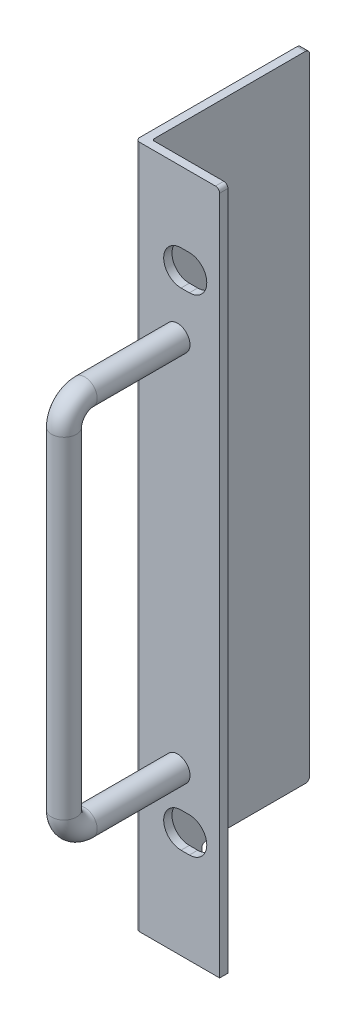
ISO-10303-21;
HEADER;
FILE_DESCRIPTION(('STEP AP214'),'2;1');
FILE_NAME('part.step','',(''),(''),'','','');
FILE_SCHEMA(('AUTOMOTIVE_DESIGN { 1 0 10303 214 1 1 1 1 }'));
ENDSEC;
DATA;
#1=APPLICATION_CONTEXT('core data for automotive mechanical design processes');
#2=APPLICATION_PROTOCOL_DEFINITION('international standard','automotive_design',2000,#1);
#3=PRODUCT_CONTEXT('',#1,'mechanical');
#4=PRODUCT('Part','Part','',(#3));
#5=PRODUCT_RELATED_PRODUCT_CATEGORY('part','',(#4));
#6=PRODUCT_DEFINITION_FORMATION('','',#4);
#7=PRODUCT_DEFINITION_CONTEXT('part definition',#1,'design');
#8=PRODUCT_DEFINITION('design','',#6,#7);
#9=PRODUCT_DEFINITION_SHAPE('','',#8);
#10=(LENGTH_UNIT() NAMED_UNIT(*) SI_UNIT(.MILLI.,.METRE.));
#11=(NAMED_UNIT(*) PLANE_ANGLE_UNIT() SI_UNIT($,.RADIAN.));
#12=(NAMED_UNIT(*) SI_UNIT($,.STERADIAN.) SOLID_ANGLE_UNIT());
#13=UNCERTAINTY_MEASURE_WITH_UNIT(LENGTH_MEASURE(1.E-05),#10,'distance_accuracy_value','');
#14=(GEOMETRIC_REPRESENTATION_CONTEXT(3) GLOBAL_UNCERTAINTY_ASSIGNED_CONTEXT((#13)) GLOBAL_UNIT_ASSIGNED_CONTEXT((#10,
#11,#12)) REPRESENTATION_CONTEXT('',''));
#15=CARTESIAN_POINT('',(0.,0.,0.));
#16=DIRECTION('',(0.,0.,1.));
#17=DIRECTION('',(1.,0.,0.));
#18=AXIS2_PLACEMENT_3D('',#15,#16,#17);
#19=CARTESIAN_POINT('',(0.,165.,0.));
#20=DIRECTION('',(0.,0.,-1.));
#21=DIRECTION('',(-1.,0.,0.));
#22=AXIS2_PLACEMENT_3D('',#19,#20,#21);
#23=PLANE('',#22);
#24=CARTESIAN_POINT('',(10.15,128.745,0.));
#25=DIRECTION('',(0.,0.,1.));
#26=DIRECTION('',(1.,0.,0.));
#27=AXIS2_PLACEMENT_3D('',#24,#25,#26);
#28=CIRCLE('',#27,3.);
#29=CARTESIAN_POINT('',(13.15,128.745,0.));
#30=VERTEX_POINT('',#29);
#31=EDGE_CURVE('E299',#30,#30,#28,.T.);
#32=ORIENTED_EDGE('',*,*,#31,.F.);
#33=EDGE_LOOP('',(#32));
#34=FACE_BOUND('',#33,.T.);
#35=DIRECTION('',(-1.,0.,0.));
#36=VECTOR('',#35,1.);
#37=CARTESIAN_POINT('',(13.,147.945,0.));
#38=LINE('',#37,#36);
#39=CARTESIAN_POINT('',(13.,147.945,0.));
#40=VERTEX_POINT('',#39);
#41=CARTESIAN_POINT('',(11.,147.945,0.));
#42=VERTEX_POINT('',#41);
#43=EDGE_CURVE('E206',#40,#42,#38,.T.);
#44=ORIENTED_EDGE('',*,*,#43,.F.);
#45=CARTESIAN_POINT('',(13.,143.745,0.));
#46=DIRECTION('',(0.,0.,1.));
#47=DIRECTION('',(1.,0.,0.));
#48=AXIS2_PLACEMENT_3D('',#45,#46,#47);
#49=CIRCLE('',#48,4.19999999999998);
#50=CARTESIAN_POINT('',(13.,139.545,0.));
#51=VERTEX_POINT('',#50);
#52=EDGE_CURVE('E211',#51,#40,#49,.T.);
#53=ORIENTED_EDGE('',*,*,#52,.F.);
#54=DIRECTION('',(1.,0.,0.));
#55=VECTOR('',#54,1.);
#56=CARTESIAN_POINT('',(13.,139.545,0.));
#57=LINE('',#56,#55);
#58=CARTESIAN_POINT('',(11.,139.545,0.));
#59=VERTEX_POINT('',#58);
#60=EDGE_CURVE('E215',#59,#51,#57,.T.);
#61=ORIENTED_EDGE('',*,*,#60,.F.);
#62=CARTESIAN_POINT('',(11.,143.745,0.));
#63=DIRECTION('',(0.,0.,1.));
#64=DIRECTION('',(1.,0.,0.));
#65=AXIS2_PLACEMENT_3D('',#62,#63,#64);
#66=CIRCLE('',#65,4.19999999999998);
#67=EDGE_CURVE('E195',#42,#59,#66,.T.);
#68=ORIENTED_EDGE('',*,*,#67,.F.);
#69=EDGE_LOOP('',(#44,#53,#61,#68));
#70=FACE_BOUND('',#69,.T.);
#71=DIRECTION('',(-1.,0.,0.));
#72=VECTOR('',#71,1.);
#73=CARTESIAN_POINT('',(13.,30.455,0.));
#74=LINE('',#73,#72);
#75=CARTESIAN_POINT('',(13.,30.455,0.));
#76=VERTEX_POINT('',#75);
#77=CARTESIAN_POINT('',(11.,30.455,0.));
#78=VERTEX_POINT('',#77);
#79=EDGE_CURVE('E227',#76,#78,#74,.T.);
#80=ORIENTED_EDGE('',*,*,#79,.F.);
#81=CARTESIAN_POINT('',(13.,26.255,0.));
#82=DIRECTION('',(0.,0.,1.));
#83=DIRECTION('',(-1.,0.,0.));
#84=AXIS2_PLACEMENT_3D('',#81,#82,#83);
#85=CIRCLE('',#84,4.19999999999997);
#86=CARTESIAN_POINT('',(13.,22.055,0.));
#87=VERTEX_POINT('',#86);
#88=EDGE_CURVE('E225',#87,#76,#85,.T.);
#89=ORIENTED_EDGE('',*,*,#88,.F.);
#90=DIRECTION('',(1.,0.,0.));
#91=VECTOR('',#90,1.);
#92=CARTESIAN_POINT('',(13.,22.055,0.));
#93=LINE('',#92,#91);
#94=CARTESIAN_POINT('',(11.,22.055,0.));
#95=VERTEX_POINT('',#94);
#96=EDGE_CURVE('E234',#95,#87,#93,.T.);
#97=ORIENTED_EDGE('',*,*,#96,.F.);
#98=CARTESIAN_POINT('',(11.,26.255,0.));
#99=DIRECTION('',(0.,0.,1.));
#100=DIRECTION('',(-1.,0.,0.));
#101=AXIS2_PLACEMENT_3D('',#98,#99,#100);
#102=CIRCLE('',#101,4.19999999999997);
#103=EDGE_CURVE('E231',#78,#95,#102,.T.);
#104=ORIENTED_EDGE('',*,*,#103,.F.);
#105=EDGE_LOOP('',(#80,#89,#97,#104));
#106=FACE_BOUND('',#105,.T.);
#107=DIRECTION('',(1.,0.,0.));
#108=VECTOR('',#107,1.);
#109=CARTESIAN_POINT('',(0.,165.,0.));
#110=LINE('',#109,#108);
#111=CARTESIAN_POINT('',(1.,165.,0.));
#112=VERTEX_POINT('',#111);
#113=CARTESIAN_POINT('',(19.3,165.,0.));
#114=VERTEX_POINT('',#113);
#115=EDGE_CURVE('E246',#112,#114,#110,.T.);
#116=ORIENTED_EDGE('',*,*,#115,.F.);
#117=DIRECTION('',(0.,-1.,0.));
#118=VECTOR('',#117,1.);
#119=CARTESIAN_POINT('',(1.,165.,0.));
#120=LINE('',#119,#118);
#121=CARTESIAN_POINT('',(1.,0.,0.));
#122=VERTEX_POINT('',#121);
#123=EDGE_CURVE('E305',#112,#122,#120,.T.);
#124=ORIENTED_EDGE('',*,*,#123,.T.);
#125=DIRECTION('',(1.,0.,0.));
#126=VECTOR('',#125,1.);
#127=CARTESIAN_POINT('',(0.,0.,0.));
#128=LINE('',#127,#126);
#129=CARTESIAN_POINT('',(20.3,0.,0.));
#130=VERTEX_POINT('',#129);
#131=EDGE_CURVE('E222',#122,#130,#128,.T.);
#132=ORIENTED_EDGE('',*,*,#131,.T.);
#133=DIRECTION('',(0.,-1.,0.));
#134=VECTOR('',#133,1.);
#135=CARTESIAN_POINT('',(20.3,165.,0.));
#136=LINE('',#135,#134);
#137=CARTESIAN_POINT('',(20.3,164.,0.));
#138=VERTEX_POINT('',#137);
#139=EDGE_CURVE('E276',#138,#130,#136,.T.);
#140=ORIENTED_EDGE('',*,*,#139,.F.);
#141=CARTESIAN_POINT('',(19.3,164.,0.));
#142=DIRECTION('',(0.,0.,-1.));
#143=DIRECTION('',(-1.,0.,0.));
#144=AXIS2_PLACEMENT_3D('',#141,#142,#143);
#145=CIRCLE('',#144,1.);
#146=EDGE_CURVE('E303',#138,#114,#145,.F.);
#147=ORIENTED_EDGE('',*,*,#146,.T.);
#148=EDGE_LOOP('',(#116,#124,#132,#140,#147));
#149=FACE_BOUND('',#148,.T.);
#150=CARTESIAN_POINT('',(10.15,38.745,0.));
#151=DIRECTION('',(0.,0.,-1.));
#152=DIRECTION('',(1.,0.,0.));
#153=AXIS2_PLACEMENT_3D('',#150,#151,#152);
#154=CIRCLE('',#153,3.);
#155=CARTESIAN_POINT('',(13.15,38.745,0.));
#156=VERTEX_POINT('',#155);
#157=EDGE_CURVE('E387',#156,#156,#154,.T.);
#158=ORIENTED_EDGE('',*,*,#157,.T.);
#159=EDGE_LOOP('',(#158));
#160=FACE_BOUND('',#159,.T.);
#161=ADVANCED_FACE('F35',(#34,#70,#106,#149,#160),#23,.F.);
#162=CARTESIAN_POINT('',(20.3,165.,0.));
#163=DIRECTION('',(-1.,0.,0.));
#164=DIRECTION('',(0.,0.,1.));
#165=AXIS2_PLACEMENT_3D('',#162,#163,#164);
#166=PLANE('',#165);
#167=DIRECTION('',(0.,-1.,0.));
#168=VECTOR('',#167,1.);
#169=CARTESIAN_POINT('',(20.3,165.,-2.));
#170=LINE('',#169,#168);
#171=CARTESIAN_POINT('',(20.3,164.,-2.));
#172=VERTEX_POINT('',#171);
#173=CARTESIAN_POINT('',(20.3,0.,-2.));
#174=VERTEX_POINT('',#173);
#175=EDGE_CURVE('E274',#172,#174,#170,.T.);
#176=ORIENTED_EDGE('',*,*,#175,.F.);
#177=DIRECTION('',(0.,0.,-1.));
#178=VECTOR('',#177,1.);
#179=CARTESIAN_POINT('',(20.3,164.,0.));
#180=LINE('',#179,#178);
#181=EDGE_CURVE('E331',#172,#138,#180,.F.);
#182=ORIENTED_EDGE('',*,*,#181,.T.);
#183=ORIENTED_EDGE('',*,*,#139,.T.);
#184=DIRECTION('',(0.,0.,-1.));
#185=VECTOR('',#184,1.);
#186=CARTESIAN_POINT('',(20.3,0.,0.));
#187=LINE('',#186,#185);
#188=EDGE_CURVE('E260',#130,#174,#187,.T.);
#189=ORIENTED_EDGE('',*,*,#188,.T.);
#190=EDGE_LOOP('',(#176,#182,#183,#189));
#191=FACE_BOUND('',#190,.T.);
#192=ADVANCED_FACE('F415',(#191),#166,.F.);
#193=CARTESIAN_POINT('',(2.,165.,-2.));
#194=DIRECTION('',(0.,0.,1.));
#195=DIRECTION('',(1.,0.,0.));
#196=AXIS2_PLACEMENT_3D('',#193,#194,#195);
#197=PLANE('',#196);
#198=DIRECTION('',(1.,0.,0.));
#199=VECTOR('',#198,1.);
#200=CARTESIAN_POINT('',(2.,139.545,-2.));
#201=LINE('',#200,#199);
#202=CARTESIAN_POINT('',(11.,139.545,-2.));
#203=VERTEX_POINT('',#202);
#204=CARTESIAN_POINT('',(13.,139.545,-2.));
#205=VERTEX_POINT('',#204);
#206=EDGE_CURVE('E293',#203,#205,#201,.T.);
#207=ORIENTED_EDGE('',*,*,#206,.T.);
#208=CARTESIAN_POINT('',(13.,143.745,-2.));
#209=DIRECTION('',(0.,0.,1.));
#210=DIRECTION('',(1.,0.,0.));
#211=AXIS2_PLACEMENT_3D('',#208,#209,#210);
#212=CIRCLE('',#211,4.19999999999998);
#213=CARTESIAN_POINT('',(13.,147.945,-2.));
#214=VERTEX_POINT('',#213);
#215=EDGE_CURVE('E296',#205,#214,#212,.T.);
#216=ORIENTED_EDGE('',*,*,#215,.T.);
#217=DIRECTION('',(-1.,0.,0.));
#218=VECTOR('',#217,1.);
#219=CARTESIAN_POINT('',(2.,147.945,-2.));
#220=LINE('',#219,#218);
#221=CARTESIAN_POINT('',(11.,147.945,-2.));
#222=VERTEX_POINT('',#221);
#223=EDGE_CURVE('E290',#214,#222,#220,.T.);
#224=ORIENTED_EDGE('',*,*,#223,.T.);
#225=CARTESIAN_POINT('',(11.,143.745,-2.));
#226=DIRECTION('',(0.,0.,1.));
#227=DIRECTION('',(1.,0.,0.));
#228=AXIS2_PLACEMENT_3D('',#225,#226,#227);
#229=CIRCLE('',#228,4.19999999999998);
#230=EDGE_CURVE('E198',#222,#203,#229,.T.);
#231=ORIENTED_EDGE('',*,*,#230,.T.);
#232=EDGE_LOOP('',(#207,#216,#224,#231));
#233=FACE_BOUND('',#232,.T.);
#234=DIRECTION('',(1.,0.,0.));
#235=VECTOR('',#234,1.);
#236=CARTESIAN_POINT('',(2.,22.055,-2.));
#237=LINE('',#236,#235);
#238=CARTESIAN_POINT('',(11.,22.055,-2.));
#239=VERTEX_POINT('',#238);
#240=CARTESIAN_POINT('',(13.,22.055,-2.));
#241=VERTEX_POINT('',#240);
#242=EDGE_CURVE('E284',#239,#241,#237,.T.);
#243=ORIENTED_EDGE('',*,*,#242,.T.);
#244=CARTESIAN_POINT('',(13.,26.255,-2.));
#245=DIRECTION('',(0.,0.,1.));
#246=DIRECTION('',(1.,0.,0.));
#247=AXIS2_PLACEMENT_3D('',#244,#245,#246);
#248=CIRCLE('',#247,4.19999999999997);
#249=CARTESIAN_POINT('',(13.,30.455,-2.));
#250=VERTEX_POINT('',#249);
#251=EDGE_CURVE('E287',#241,#250,#248,.T.);
#252=ORIENTED_EDGE('',*,*,#251,.T.);
#253=DIRECTION('',(-1.,0.,0.));
#254=VECTOR('',#253,1.);
#255=CARTESIAN_POINT('',(2.,30.455,-2.));
#256=LINE('',#255,#254);
#257=CARTESIAN_POINT('',(11.,30.455,-2.));
#258=VERTEX_POINT('',#257);
#259=EDGE_CURVE('E278',#250,#258,#256,.T.);
#260=ORIENTED_EDGE('',*,*,#259,.T.);
#261=CARTESIAN_POINT('',(11.,26.255,-2.));
#262=DIRECTION('',(0.,0.,1.));
#263=DIRECTION('',(1.,0.,0.));
#264=AXIS2_PLACEMENT_3D('',#261,#262,#263);
#265=CIRCLE('',#264,4.19999999999997);
#266=EDGE_CURVE('E281',#258,#239,#265,.T.);
#267=ORIENTED_EDGE('',*,*,#266,.T.);
#268=EDGE_LOOP('',(#243,#252,#260,#267));
#269=FACE_BOUND('',#268,.T.);
#270=DIRECTION('',(-1.,0.,0.));
#271=VECTOR('',#270,1.);
#272=CARTESIAN_POINT('',(2.,0.,-2.));
#273=LINE('',#272,#271);
#274=CARTESIAN_POINT('',(2.5,0.,-2.));
#275=VERTEX_POINT('',#274);
#276=EDGE_CURVE('E263',#174,#275,#273,.T.);
#277=ORIENTED_EDGE('',*,*,#276,.T.);
#278=DIRECTION('',(0.,-1.,0.));
#279=VECTOR('',#278,1.);
#280=CARTESIAN_POINT('',(2.5,165.,-2.));
#281=LINE('',#280,#279);
#282=CARTESIAN_POINT('',(2.5,165.,-2.));
#283=VERTEX_POINT('',#282);
#284=EDGE_CURVE('E56',#275,#283,#281,.F.);
#285=ORIENTED_EDGE('',*,*,#284,.T.);
#286=DIRECTION('',(-1.,0.,0.));
#287=VECTOR('',#286,1.);
#288=CARTESIAN_POINT('',(2.,165.,-2.));
#289=LINE('',#288,#287);
#290=CARTESIAN_POINT('',(19.3,165.,-2.));
#291=VERTEX_POINT('',#290);
#292=EDGE_CURVE('E249',#291,#283,#289,.T.);
#293=ORIENTED_EDGE('',*,*,#292,.F.);
#294=CARTESIAN_POINT('',(19.3,164.,-2.));
#295=DIRECTION('',(0.,0.,1.));
#296=DIRECTION('',(1.,0.,0.));
#297=AXIS2_PLACEMENT_3D('',#294,#295,#296);
#298=CIRCLE('',#297,1.);
#299=EDGE_CURVE('E329',#291,#172,#298,.F.);
#300=ORIENTED_EDGE('',*,*,#299,.T.);
#301=ORIENTED_EDGE('',*,*,#175,.T.);
#302=EDGE_LOOP('',(#277,#285,#293,#300,#301));
#303=FACE_BOUND('',#302,.T.);
#304=ADVANCED_FACE('F412',(#233,#269,#303),#197,.F.);
#305=CARTESIAN_POINT('',(2.,165.,-2.));
#306=DIRECTION('',(-1.,0.,0.));
#307=DIRECTION('',(0.,0.,1.));
#308=AXIS2_PLACEMENT_3D('',#305,#306,#307);
#309=PLANE('',#308);
#310=DIRECTION('',(0.,0.,-1.));
#311=VECTOR('',#310,1.);
#312=CARTESIAN_POINT('',(2.,165.,-2.));
#313=LINE('',#312,#311);
#314=CARTESIAN_POINT('',(2.,165.,-2.5));
#315=VERTEX_POINT('',#314);
#316=CARTESIAN_POINT('',(2.,165.,-39.));
#317=VERTEX_POINT('',#316);
#318=EDGE_CURVE('E252',#315,#317,#313,.T.);
#319=ORIENTED_EDGE('',*,*,#318,.F.);
#320=DIRECTION('',(0.,-1.,0.));
#321=VECTOR('',#320,1.);
#322=CARTESIAN_POINT('',(2.,0.,-2.5));
#323=LINE('',#322,#321);
#324=CARTESIAN_POINT('',(2.,0.,-2.5));
#325=VERTEX_POINT('',#324);
#326=EDGE_CURVE('E358',#315,#325,#323,.T.);
#327=ORIENTED_EDGE('',*,*,#326,.T.);
#328=DIRECTION('',(0.,0.,-1.));
#329=VECTOR('',#328,1.);
#330=CARTESIAN_POINT('',(2.,0.,-2.));
#331=LINE('',#330,#329);
#332=CARTESIAN_POINT('',(2.,0.,-13.));
#333=VERTEX_POINT('',#332);
#334=EDGE_CURVE('E265',#325,#333,#331,.T.);
#335=ORIENTED_EDGE('',*,*,#334,.T.);
#336=CARTESIAN_POINT('',(2.,1.,-13.));
#337=DIRECTION('',(-1.,0.,0.));
#338=DIRECTION('',(0.,0.,1.));
#339=AXIS2_PLACEMENT_3D('',#336,#337,#338);
#340=CIRCLE('',#339,1.);
#341=CARTESIAN_POINT('',(2.,1.,-14.));
#342=VERTEX_POINT('',#341);
#343=EDGE_CURVE('E337',#333,#342,#340,.F.);
#344=ORIENTED_EDGE('',*,*,#343,.T.);
#345=DIRECTION('',(0.,-1.,0.));
#346=VECTOR('',#345,1.);
#347=CARTESIAN_POINT('',(2.,0.,-14.));
#348=LINE('',#347,#346);
#349=CARTESIAN_POINT('',(2.,11.,-14.));
#350=VERTEX_POINT('',#349);
#351=EDGE_CURVE('E378',#350,#342,#348,.T.);
#352=ORIENTED_EDGE('',*,*,#351,.F.);
#353=CARTESIAN_POINT('',(2.,11.,-15.));
#354=DIRECTION('',(-1.,0.,0.));
#355=DIRECTION('',(0.,0.,1.));
#356=AXIS2_PLACEMENT_3D('',#353,#354,#355);
#357=CIRCLE('',#356,1.);
#358=CARTESIAN_POINT('',(2.,12.,-15.));
#359=VERTEX_POINT('',#358);
#360=EDGE_CURVE('E354',#350,#359,#357,.T.);
#361=ORIENTED_EDGE('',*,*,#360,.T.);
#362=DIRECTION('',(0.,0.,1.));
#363=VECTOR('',#362,1.);
#364=CARTESIAN_POINT('',(2.,12.,-40.));
#365=LINE('',#364,#363);
#366=CARTESIAN_POINT('',(2.,12.,-39.));
#367=VERTEX_POINT('',#366);
#368=EDGE_CURVE('E385',#367,#359,#365,.T.);
#369=ORIENTED_EDGE('',*,*,#368,.F.);
#370=CARTESIAN_POINT('',(2.,13.,-39.));
#371=DIRECTION('',(-1.,0.,0.));
#372=DIRECTION('',(0.,0.,1.));
#373=AXIS2_PLACEMENT_3D('',#370,#371,#372);
#374=CIRCLE('',#373,1.);
#375=CARTESIAN_POINT('',(2.,13.,-40.));
#376=VERTEX_POINT('',#375);
#377=EDGE_CURVE('E339',#367,#376,#374,.F.);
#378=ORIENTED_EDGE('',*,*,#377,.T.);
#379=DIRECTION('',(0.,-1.,0.));
#380=VECTOR('',#379,1.);
#381=CARTESIAN_POINT('',(2.,165.,-40.));
#382=LINE('',#381,#380);
#383=CARTESIAN_POINT('',(2.,164.,-40.));
#384=VERTEX_POINT('',#383);
#385=EDGE_CURVE('E271',#384,#376,#382,.T.);
#386=ORIENTED_EDGE('',*,*,#385,.F.);
#387=CARTESIAN_POINT('',(2.,164.,-39.));
#388=DIRECTION('',(-1.,0.,0.));
#389=DIRECTION('',(0.,0.,1.));
#390=AXIS2_PLACEMENT_3D('',#387,#388,#389);
#391=CIRCLE('',#390,1.);
#392=EDGE_CURVE('E341',#384,#317,#391,.F.);
#393=ORIENTED_EDGE('',*,*,#392,.T.);
#394=EDGE_LOOP('',(#319,#327,#335,#344,#352,#361,#369,#378,#386,#393));
#395=FACE_BOUND('',#394,.T.);
#396=ADVANCED_FACE('F364',(#395),#309,.F.);
#397=CARTESIAN_POINT('',(0.,165.,-40.));
#398=DIRECTION('',(0.,0.,1.));
#399=DIRECTION('',(1.,0.,0.));
#400=AXIS2_PLACEMENT_3D('',#397,#398,#399);
#401=PLANE('',#400);
#402=DIRECTION('',(0.,-1.,0.));
#403=VECTOR('',#402,1.);
#404=CARTESIAN_POINT('',(0.,165.,-40.));
#405=LINE('',#404,#403);
#406=CARTESIAN_POINT('',(0.,164.,-40.));
#407=VERTEX_POINT('',#406);
#408=CARTESIAN_POINT('',(0.,13.,-40.));
#409=VERTEX_POINT('',#408);
#410=EDGE_CURVE('E257',#407,#409,#405,.T.);
#411=ORIENTED_EDGE('',*,*,#410,.F.);
#412=DIRECTION('',(-1.,0.,0.));
#413=VECTOR('',#412,1.);
#414=CARTESIAN_POINT('',(2.,164.,-40.));
#415=LINE('',#414,#413);
#416=EDGE_CURVE('E335',#407,#384,#415,.F.);
#417=ORIENTED_EDGE('',*,*,#416,.T.);
#418=ORIENTED_EDGE('',*,*,#385,.T.);
#419=DIRECTION('',(1.,0.,0.));
#420=VECTOR('',#419,1.);
#421=CARTESIAN_POINT('',(0.,13.,-40.));
#422=LINE('',#421,#420);
#423=EDGE_CURVE('E333',#376,#409,#422,.F.);
#424=ORIENTED_EDGE('',*,*,#423,.T.);
#425=EDGE_LOOP('',(#411,#417,#418,#424));
#426=FACE_BOUND('',#425,.T.);
#427=ADVANCED_FACE('F456',(#426),#401,.F.);
#428=CARTESIAN_POINT('',(0.,165.,0.));
#429=DIRECTION('',(1.,0.,0.));
#430=DIRECTION('',(0.,0.,-1.));
#431=AXIS2_PLACEMENT_3D('',#428,#429,#430);
#432=PLANE('',#431);
#433=DIRECTION('',(0.,0.,1.));
#434=VECTOR('',#433,1.);
#435=CARTESIAN_POINT('',(0.,0.,0.));
#436=LINE('',#435,#434);
#437=CARTESIAN_POINT('',(0.,0.,-13.));
#438=VERTEX_POINT('',#437);
#439=CARTESIAN_POINT('',(0.,0.,-1.));
#440=VERTEX_POINT('',#439);
#441=EDGE_CURVE('E250',#438,#440,#436,.T.);
#442=ORIENTED_EDGE('',*,*,#441,.T.);
#443=DIRECTION('',(0.,-1.,0.));
#444=VECTOR('',#443,1.);
#445=CARTESIAN_POINT('',(0.,165.,-1.));
#446=LINE('',#445,#444);
#447=CARTESIAN_POINT('',(0.,165.,-1.));
#448=VERTEX_POINT('',#447);
#449=EDGE_CURVE('E319',#440,#448,#446,.F.);
#450=ORIENTED_EDGE('',*,*,#449,.T.);
#451=DIRECTION('',(0.,0.,1.));
#452=VECTOR('',#451,1.);
#453=CARTESIAN_POINT('',(0.,165.,0.));
#454=LINE('',#453,#452);
#455=CARTESIAN_POINT('',(0.,165.,-39.));
#456=VERTEX_POINT('',#455);
#457=EDGE_CURVE('E254',#456,#448,#454,.T.);
#458=ORIENTED_EDGE('',*,*,#457,.F.);
#459=CARTESIAN_POINT('',(0.,164.,-39.));
#460=DIRECTION('',(1.,0.,0.));
#461=DIRECTION('',(0.,0.,-1.));
#462=AXIS2_PLACEMENT_3D('',#459,#460,#461);
#463=CIRCLE('',#462,1.);
#464=EDGE_CURVE('E317',#456,#407,#463,.F.);
#465=ORIENTED_EDGE('',*,*,#464,.T.);
#466=ORIENTED_EDGE('',*,*,#410,.T.);
#467=CARTESIAN_POINT('',(0.,13.,-39.));
#468=DIRECTION('',(1.,0.,0.));
#469=DIRECTION('',(0.,0.,-1.));
#470=AXIS2_PLACEMENT_3D('',#467,#468,#469);
#471=CIRCLE('',#470,1.);
#472=CARTESIAN_POINT('',(0.,12.,-39.));
#473=VERTEX_POINT('',#472);
#474=EDGE_CURVE('E315',#409,#473,#471,.F.);
#475=ORIENTED_EDGE('',*,*,#474,.T.);
#476=DIRECTION('',(0.,0.,1.));
#477=VECTOR('',#476,1.);
#478=CARTESIAN_POINT('',(0.,12.,0.));
#479=LINE('',#478,#477);
#480=CARTESIAN_POINT('',(0.,12.,-15.));
#481=VERTEX_POINT('',#480);
#482=EDGE_CURVE('E300',#473,#481,#479,.T.);
#483=ORIENTED_EDGE('',*,*,#482,.T.);
#484=CARTESIAN_POINT('',(0.,11.,-15.));
#485=DIRECTION('',(1.,0.,0.));
#486=DIRECTION('',(0.,0.,-1.));
#487=AXIS2_PLACEMENT_3D('',#484,#485,#486);
#488=CIRCLE('',#487,1.);
#489=CARTESIAN_POINT('',(0.,11.,-14.));
#490=VERTEX_POINT('',#489);
#491=EDGE_CURVE('E356',#481,#490,#488,.T.);
#492=ORIENTED_EDGE('',*,*,#491,.T.);
#493=DIRECTION('',(0.,-1.,0.));
#494=VECTOR('',#493,1.);
#495=CARTESIAN_POINT('',(0.,165.,-14.));
#496=LINE('',#495,#494);
#497=CARTESIAN_POINT('',(0.,1.,-14.));
#498=VERTEX_POINT('',#497);
#499=EDGE_CURVE('E384',#490,#498,#496,.T.);
#500=ORIENTED_EDGE('',*,*,#499,.T.);
#501=CARTESIAN_POINT('',(0.,1.,-13.));
#502=DIRECTION('',(1.,0.,0.));
#503=DIRECTION('',(0.,0.,-1.));
#504=AXIS2_PLACEMENT_3D('',#501,#502,#503);
#505=CIRCLE('',#504,1.);
#506=EDGE_CURVE('E313',#498,#438,#505,.F.);
#507=ORIENTED_EDGE('',*,*,#506,.T.);
#508=EDGE_LOOP('',(#442,#450,#458,#465,#466,#475,#483,#492,#500,#507));
#509=FACE_BOUND('',#508,.T.);
#510=ADVANCED_FACE('F438',(#509),#432,.F.);
#511=CARTESIAN_POINT('',(0.,165.,0.));
#512=DIRECTION('',(0.,1.,0.));
#513=DIRECTION('',(0.,0.,1.));
#514=AXIS2_PLACEMENT_3D('',#511,#512,#513);
#515=PLANE('',#514);
#516=ORIENTED_EDGE('',*,*,#457,.T.);
#517=CARTESIAN_POINT('',(1.,165.,-1.));
#518=DIRECTION('',(0.,1.,0.));
#519=DIRECTION('',(0.,0.,1.));
#520=AXIS2_PLACEMENT_3D('',#517,#518,#519);
#521=CIRCLE('',#520,1.);
#522=EDGE_CURVE('E327',#448,#112,#521,.T.);
#523=ORIENTED_EDGE('',*,*,#522,.T.);
#524=ORIENTED_EDGE('',*,*,#115,.T.);
#525=DIRECTION('',(0.,0.,-1.));
#526=VECTOR('',#525,1.);
#527=CARTESIAN_POINT('',(19.3,165.,-2.));
#528=LINE('',#527,#526);
#529=EDGE_CURVE('E324',#114,#291,#528,.T.);
#530=ORIENTED_EDGE('',*,*,#529,.T.);
#531=ORIENTED_EDGE('',*,*,#292,.T.);
#532=CARTESIAN_POINT('',(2.5,165.,-2.5));
#533=DIRECTION('',(0.,1.,0.));
#534=DIRECTION('',(0.,0.,1.));
#535=AXIS2_PLACEMENT_3D('',#532,#533,#534);
#536=CIRCLE('',#535,0.5);
#537=EDGE_CURVE('E11',#283,#315,#536,.F.);
#538=ORIENTED_EDGE('',*,*,#537,.T.);
#539=ORIENTED_EDGE('',*,*,#318,.T.);
#540=DIRECTION('',(-1.,0.,0.));
#541=VECTOR('',#540,1.);
#542=CARTESIAN_POINT('',(0.,165.,-39.));
#543=LINE('',#542,#541);
#544=EDGE_CURVE('E321',#317,#456,#543,.T.);
#545=ORIENTED_EDGE('',*,*,#544,.T.);
#546=EDGE_LOOP('',(#516,#523,#524,#530,#531,#538,#539,#545));
#547=FACE_BOUND('',#546,.T.);
#548=ADVANCED_FACE('F420',(#547),#515,.T.);
#549=CARTESIAN_POINT('',(0.,0.,0.));
#550=DIRECTION('',(0.,1.,0.));
#551=DIRECTION('',(0.,0.,1.));
#552=AXIS2_PLACEMENT_3D('',#549,#550,#551);
#553=PLANE('',#552);
#554=ORIENTED_EDGE('',*,*,#131,.F.);
#555=CARTESIAN_POINT('',(1.,0.,-1.));
#556=DIRECTION('',(0.,1.,0.));
#557=DIRECTION('',(0.,0.,1.));
#558=AXIS2_PLACEMENT_3D('',#555,#556,#557);
#559=CIRCLE('',#558,1.);
#560=EDGE_CURVE('E311',#122,#440,#559,.F.);
#561=ORIENTED_EDGE('',*,*,#560,.T.);
#562=ORIENTED_EDGE('',*,*,#441,.F.);
#563=DIRECTION('',(1.,0.,0.));
#564=VECTOR('',#563,1.);
#565=CARTESIAN_POINT('',(0.,0.,-13.));
#566=LINE('',#565,#564);
#567=EDGE_CURVE('E308',#438,#333,#566,.T.);
#568=ORIENTED_EDGE('',*,*,#567,.T.);
#569=ORIENTED_EDGE('',*,*,#334,.F.);
#570=CARTESIAN_POINT('',(2.5,0.,-2.5));
#571=DIRECTION('',(0.,1.,0.));
#572=DIRECTION('',(0.,0.,1.));
#573=AXIS2_PLACEMENT_3D('',#570,#571,#572);
#574=CIRCLE('',#573,0.5);
#575=EDGE_CURVE('E43',#325,#275,#574,.T.);
#576=ORIENTED_EDGE('',*,*,#575,.T.);
#577=ORIENTED_EDGE('',*,*,#276,.F.);
#578=ORIENTED_EDGE('',*,*,#188,.F.);
#579=EDGE_LOOP('',(#554,#561,#562,#568,#569,#576,#577,#578));
#580=FACE_BOUND('',#579,.T.);
#581=ADVANCED_FACE('F369',(#580),#553,.F.);
#582=CARTESIAN_POINT('',(13.,26.255,-132.));
#583=DIRECTION('',(0.,0.,1.));
#584=DIRECTION('',(1.,0.,0.));
#585=AXIS2_PLACEMENT_3D('',#582,#583,#584);
#586=CYLINDRICAL_SURFACE('',#585,4.19999999999997);
#587=DIRECTION('',(0.,0.,1.));
#588=VECTOR('',#587,1.);
#589=CARTESIAN_POINT('',(13.,22.055,-132.));
#590=LINE('',#589,#588);
#591=EDGE_CURVE('E238',#241,#87,#590,.T.);
#592=ORIENTED_EDGE('',*,*,#591,.T.);
#593=ORIENTED_EDGE('',*,*,#88,.T.);
#594=DIRECTION('',(0.,0.,1.));
#595=VECTOR('',#594,1.);
#596=CARTESIAN_POINT('',(13.,30.455,-132.));
#597=LINE('',#596,#595);
#598=EDGE_CURVE('E237',#250,#76,#597,.T.);
#599=ORIENTED_EDGE('',*,*,#598,.F.);
#600=ORIENTED_EDGE('',*,*,#251,.F.);
#601=EDGE_LOOP('',(#592,#593,#599,#600));
#602=FACE_BOUND('',#601,.T.);
#603=ADVANCED_FACE('F521',(#602),#586,.F.);
#604=CARTESIAN_POINT('',(13.,22.055,-132.));
#605=DIRECTION('',(0.,-1.,0.));
#606=DIRECTION('',(0.,0.,-1.));
#607=AXIS2_PLACEMENT_3D('',#604,#605,#606);
#608=PLANE('',#607);
#609=DIRECTION('',(0.,0.,1.));
#610=VECTOR('',#609,1.);
#611=CARTESIAN_POINT('',(11.,22.055,-132.));
#612=LINE('',#611,#610);
#613=EDGE_CURVE('E240',#239,#95,#612,.T.);
#614=ORIENTED_EDGE('',*,*,#613,.T.);
#615=ORIENTED_EDGE('',*,*,#96,.T.);
#616=ORIENTED_EDGE('',*,*,#591,.F.);
#617=ORIENTED_EDGE('',*,*,#242,.F.);
#618=EDGE_LOOP('',(#614,#615,#616,#617));
#619=FACE_BOUND('',#618,.T.);
#620=ADVANCED_FACE('F517',(#619),#608,.F.);
#621=CARTESIAN_POINT('',(11.,26.255,-132.));
#622=DIRECTION('',(0.,0.,1.));
#623=DIRECTION('',(1.,0.,0.));
#624=AXIS2_PLACEMENT_3D('',#621,#622,#623);
#625=CYLINDRICAL_SURFACE('',#624,4.19999999999997);
#626=DIRECTION('',(0.,0.,1.));
#627=VECTOR('',#626,1.);
#628=CARTESIAN_POINT('',(11.,30.455,-132.));
#629=LINE('',#628,#627);
#630=EDGE_CURVE('E242',#258,#78,#629,.T.);
#631=ORIENTED_EDGE('',*,*,#630,.T.);
#632=ORIENTED_EDGE('',*,*,#103,.T.);
#633=ORIENTED_EDGE('',*,*,#613,.F.);
#634=ORIENTED_EDGE('',*,*,#266,.F.);
#635=EDGE_LOOP('',(#631,#632,#633,#634));
#636=FACE_BOUND('',#635,.T.);
#637=ADVANCED_FACE('F520',(#636),#625,.F.);
#638=CARTESIAN_POINT('',(13.,30.455,-132.));
#639=DIRECTION('',(0.,1.,0.));
#640=DIRECTION('',(0.,0.,1.));
#641=AXIS2_PLACEMENT_3D('',#638,#639,#640);
#642=PLANE('',#641);
#643=ORIENTED_EDGE('',*,*,#598,.T.);
#644=ORIENTED_EDGE('',*,*,#79,.T.);
#645=ORIENTED_EDGE('',*,*,#630,.F.);
#646=ORIENTED_EDGE('',*,*,#259,.F.);
#647=EDGE_LOOP('',(#643,#644,#645,#646));
#648=FACE_BOUND('',#647,.T.);
#649=ADVANCED_FACE('F516',(#648),#642,.F.);
#650=CARTESIAN_POINT('',(13.,143.745,-132.));
#651=DIRECTION('',(0.,0.,1.));
#652=DIRECTION('',(1.,0.,0.));
#653=AXIS2_PLACEMENT_3D('',#650,#651,#652);
#654=CYLINDRICAL_SURFACE('',#653,4.19999999999998);
#655=DIRECTION('',(0.,0.,1.));
#656=VECTOR('',#655,1.);
#657=CARTESIAN_POINT('',(13.,139.545,-132.));
#658=LINE('',#657,#656);
#659=EDGE_CURVE('E220',#205,#51,#658,.T.);
#660=ORIENTED_EDGE('',*,*,#659,.T.);
#661=ORIENTED_EDGE('',*,*,#52,.T.);
#662=DIRECTION('',(0.,0.,1.));
#663=VECTOR('',#662,1.);
#664=CARTESIAN_POINT('',(13.,147.945,-132.));
#665=LINE('',#664,#663);
#666=EDGE_CURVE('E202',#214,#40,#665,.T.);
#667=ORIENTED_EDGE('',*,*,#666,.F.);
#668=ORIENTED_EDGE('',*,*,#215,.F.);
#669=EDGE_LOOP('',(#660,#661,#667,#668));
#670=FACE_BOUND('',#669,.T.);
#671=ADVANCED_FACE('F407',(#670),#654,.F.);
#672=CARTESIAN_POINT('',(13.,139.545,-132.));
#673=DIRECTION('',(0.,-1.,0.));
#674=DIRECTION('',(0.,0.,-1.));
#675=AXIS2_PLACEMENT_3D('',#672,#673,#674);
#676=PLANE('',#675);
#677=DIRECTION('',(0.,0.,1.));
#678=VECTOR('',#677,1.);
#679=CARTESIAN_POINT('',(11.,139.545,-132.));
#680=LINE('',#679,#678);
#681=EDGE_CURVE('E201',#203,#59,#680,.T.);
#682=ORIENTED_EDGE('',*,*,#681,.T.);
#683=ORIENTED_EDGE('',*,*,#60,.T.);
#684=ORIENTED_EDGE('',*,*,#659,.F.);
#685=ORIENTED_EDGE('',*,*,#206,.F.);
#686=EDGE_LOOP('',(#682,#683,#684,#685));
#687=FACE_BOUND('',#686,.T.);
#688=ADVANCED_FACE('F410',(#687),#676,.F.);
#689=CARTESIAN_POINT('',(11.,143.745,-132.));
#690=DIRECTION('',(0.,0.,1.));
#691=DIRECTION('',(1.,0.,0.));
#692=AXIS2_PLACEMENT_3D('',#689,#690,#691);
#693=CYLINDRICAL_SURFACE('',#692,4.19999999999998);
#694=DIRECTION('',(0.,0.,1.));
#695=VECTOR('',#694,1.);
#696=CARTESIAN_POINT('',(11.,147.945,-132.));
#697=LINE('',#696,#695);
#698=EDGE_CURVE('E190',#222,#42,#697,.T.);
#699=ORIENTED_EDGE('',*,*,#698,.T.);
#700=ORIENTED_EDGE('',*,*,#67,.T.);
#701=ORIENTED_EDGE('',*,*,#681,.F.);
#702=ORIENTED_EDGE('',*,*,#230,.F.);
#703=EDGE_LOOP('',(#699,#700,#701,#702));
#704=FACE_BOUND('',#703,.T.);
#705=ADVANCED_FACE('F192',(#704),#693,.F.);
#706=CARTESIAN_POINT('',(13.,147.945,-132.));
#707=DIRECTION('',(0.,1.,0.));
#708=DIRECTION('',(0.,0.,1.));
#709=AXIS2_PLACEMENT_3D('',#706,#707,#708);
#710=PLANE('',#709);
#711=ORIENTED_EDGE('',*,*,#666,.T.);
#712=ORIENTED_EDGE('',*,*,#43,.T.);
#713=ORIENTED_EDGE('',*,*,#698,.F.);
#714=ORIENTED_EDGE('',*,*,#223,.F.);
#715=EDGE_LOOP('',(#711,#712,#713,#714));
#716=FACE_BOUND('',#715,.T.);
#717=ADVANCED_FACE('F207',(#716),#710,.F.);
#718=CARTESIAN_POINT('',(10.15,38.745,0.));
#719=DIRECTION('',(0.,0.,1.));
#720=DIRECTION('',(1.,0.,0.));
#721=AXIS2_PLACEMENT_3D('',#718,#719,#720);
#722=CYLINDRICAL_SURFACE('',#721,3.);
#723=CARTESIAN_POINT('',(10.15,38.745,22.4));
#724=DIRECTION('',(0.,0.,-1.));
#725=DIRECTION('',(1.,0.,0.));
#726=AXIS2_PLACEMENT_3D('',#723,#724,#725);
#727=CIRCLE('',#726,3.);
#728=CARTESIAN_POINT('',(10.15,35.745,22.4));
#729=VERTEX_POINT('',#728);
#730=EDGE_CURVE('E394',#729,#729,#727,.T.);
#731=ORIENTED_EDGE('',*,*,#730,.T.);
#732=EDGE_LOOP('',(#731));
#733=FACE_BOUND('',#732,.T.);
#734=ORIENTED_EDGE('',*,*,#157,.F.);
#735=EDGE_LOOP('',(#734));
#736=FACE_BOUND('',#735,.T.);
#737=ADVANCED_FACE('F488',(#733,#736),#722,.T.);
#738=CARTESIAN_POINT('',(10.15,43.745,22.4));
#739=DIRECTION('',(-1.,0.,0.));
#740=DIRECTION('',(0.,0.,1.));
#741=AXIS2_PLACEMENT_3D('',#738,#739,#740);
#742=TOROIDAL_SURFACE('',#741,4.99999999999996,3.);
#743=CARTESIAN_POINT('',(10.15,43.745,27.4));
#744=DIRECTION('',(0.,-1.,0.));
#745=DIRECTION('',(1.,0.,0.));
#746=AXIS2_PLACEMENT_3D('',#743,#744,#745);
#747=CIRCLE('',#746,3.);
#748=CARTESIAN_POINT('',(10.15,43.745,30.4));
#749=VERTEX_POINT('',#748);
#750=EDGE_CURVE('E397',#749,#749,#747,.T.);
#751=CARTESIAN_POINT('',(10.15,43.745,22.4));
#752=DIRECTION('',(-1.,0.,0.));
#753=DIRECTION('',(0.,0.,1.));
#754=AXIS2_PLACEMENT_3D('',#751,#752,#753);
#755=CIRCLE('',#754,7.99999999999997);
#756=EDGE_CURVE('',#729,#749,#755,.T.);
#757=ORIENTED_EDGE('',*,*,#730,.F.);
#758=ORIENTED_EDGE('',*,*,#750,.T.);
#759=ORIENTED_EDGE('',*,*,#756,.T.);
#760=ORIENTED_EDGE('',*,*,#756,.F.);
#761=EDGE_LOOP('',(#757,#759,#758,#760));
#762=FACE_BOUND('',#761,.T.);
#763=ADVANCED_FACE('F492',(#762),#742,.T.);
#764=CARTESIAN_POINT('',(10.15,43.745,27.4));
#765=DIRECTION('',(0.,1.,0.));
#766=DIRECTION('',(0.,0.,1.));
#767=AXIS2_PLACEMENT_3D('',#764,#765,#766);
#768=CYLINDRICAL_SURFACE('',#767,3.);
#769=CARTESIAN_POINT('',(10.15,123.745,27.4));
#770=DIRECTION('',(0.,-1.,0.));
#771=DIRECTION('',(1.,0.,0.));
#772=AXIS2_PLACEMENT_3D('',#769,#770,#771);
#773=CIRCLE('',#772,3.);
#774=CARTESIAN_POINT('',(10.15,123.745,30.4));
#775=VERTEX_POINT('',#774);
#776=EDGE_CURVE('E400',#775,#775,#773,.T.);
#777=ORIENTED_EDGE('',*,*,#776,.T.);
#778=EDGE_LOOP('',(#777));
#779=FACE_BOUND('',#778,.T.);
#780=ORIENTED_EDGE('',*,*,#750,.F.);
#781=EDGE_LOOP('',(#780));
#782=FACE_BOUND('',#781,.T.);
#783=ADVANCED_FACE('F496',(#779,#782),#768,.T.);
#784=CARTESIAN_POINT('',(10.15,123.745,22.4));
#785=DIRECTION('',(-1.,0.,0.));
#786=DIRECTION('',(0.,0.,1.));
#787=AXIS2_PLACEMENT_3D('',#784,#785,#786);
#788=TOROIDAL_SURFACE('',#787,4.99999999999998,3.);
#789=CARTESIAN_POINT('',(10.15,128.745,22.4));
#790=DIRECTION('',(0.,0.,1.));
#791=DIRECTION('',(1.,0.,0.));
#792=AXIS2_PLACEMENT_3D('',#789,#790,#791);
#793=CIRCLE('',#792,3.);
#794=CARTESIAN_POINT('',(10.15,131.745,22.4));
#795=VERTEX_POINT('',#794);
#796=EDGE_CURVE('E228',#795,#795,#793,.T.);
#797=CARTESIAN_POINT('',(10.15,123.745,22.4));
#798=DIRECTION('',(-1.,0.,0.));
#799=DIRECTION('',(0.,0.,1.));
#800=AXIS2_PLACEMENT_3D('',#797,#798,#799);
#801=CIRCLE('',#800,7.99999999999998);
#802=EDGE_CURVE('',#775,#795,#801,.T.);
#803=ORIENTED_EDGE('',*,*,#776,.F.);
#804=ORIENTED_EDGE('',*,*,#796,.T.);
#805=ORIENTED_EDGE('',*,*,#802,.T.);
#806=ORIENTED_EDGE('',*,*,#802,.F.);
#807=EDGE_LOOP('',(#803,#805,#804,#806));
#808=FACE_BOUND('',#807,.T.);
#809=ADVANCED_FACE('F500',(#808),#788,.T.);
#810=CARTESIAN_POINT('',(10.15,128.745,22.4));
#811=DIRECTION('',(0.,0.,-1.));
#812=DIRECTION('',(-1.,0.,0.));
#813=AXIS2_PLACEMENT_3D('',#810,#811,#812);
#814=CYLINDRICAL_SURFACE('',#813,3.);
#815=ORIENTED_EDGE('',*,*,#31,.T.);
#816=EDGE_LOOP('',(#815));
#817=FACE_BOUND('',#816,.T.);
#818=ORIENTED_EDGE('',*,*,#796,.F.);
#819=EDGE_LOOP('',(#818));
#820=FACE_BOUND('',#819,.T.);
#821=ADVANCED_FACE('F486',(#817,#820),#814,.T.);
#822=CARTESIAN_POINT('',(-130.,12.,-40.));
#823=DIRECTION('',(0.,1.,0.));
#824=DIRECTION('',(0.,0.,1.));
#825=AXIS2_PLACEMENT_3D('',#822,#823,#824);
#826=PLANE('',#825);
#827=ORIENTED_EDGE('',*,*,#482,.F.);
#828=DIRECTION('',(1.,0.,0.));
#829=VECTOR('',#828,1.);
#830=CARTESIAN_POINT('',(-130.,12.,-39.));
#831=LINE('',#830,#829);
#832=EDGE_CURVE('E346',#473,#367,#831,.T.);
#833=ORIENTED_EDGE('',*,*,#832,.T.);
#834=ORIENTED_EDGE('',*,*,#368,.T.);
#835=DIRECTION('',(1.,0.,0.));
#836=VECTOR('',#835,1.);
#837=CARTESIAN_POINT('',(0.,12.,-15.));
#838=LINE('',#837,#836);
#839=EDGE_CURVE('E344',#359,#481,#838,.F.);
#840=ORIENTED_EDGE('',*,*,#839,.T.);
#841=EDGE_LOOP('',(#827,#833,#834,#840));
#842=FACE_BOUND('',#841,.T.);
#843=ADVANCED_FACE('F446',(#842),#826,.F.);
#844=CARTESIAN_POINT('',(-130.,0.,-14.));
#845=DIRECTION('',(0.,0.,1.));
#846=DIRECTION('',(1.,0.,0.));
#847=AXIS2_PLACEMENT_3D('',#844,#845,#846);
#848=PLANE('',#847);
#849=ORIENTED_EDGE('',*,*,#499,.F.);
#850=DIRECTION('',(1.,0.,0.));
#851=VECTOR('',#850,1.);
#852=CARTESIAN_POINT('',(2.,11.,-14.));
#853=LINE('',#852,#851);
#854=EDGE_CURVE('E351',#490,#350,#853,.T.);
#855=ORIENTED_EDGE('',*,*,#854,.T.);
#856=ORIENTED_EDGE('',*,*,#351,.T.);
#857=DIRECTION('',(1.,0.,0.));
#858=VECTOR('',#857,1.);
#859=CARTESIAN_POINT('',(-130.,1.,-14.));
#860=LINE('',#859,#858);
#861=EDGE_CURVE('E349',#342,#498,#860,.F.);
#862=ORIENTED_EDGE('',*,*,#861,.T.);
#863=EDGE_LOOP('',(#849,#855,#856,#862));
#864=FACE_BOUND('',#863,.T.);
#865=ADVANCED_FACE('F381',(#864),#848,.F.);
#866=CARTESIAN_POINT('',(1.,165.,-1.));
#867=DIRECTION('',(0.,-1.,0.));
#868=DIRECTION('',(0.,0.,-1.));
#869=AXIS2_PLACEMENT_3D('',#866,#867,#868);
#870=CYLINDRICAL_SURFACE('',#869,1.);
#871=ORIENTED_EDGE('',*,*,#522,.F.);
#872=ORIENTED_EDGE('',*,*,#449,.F.);
#873=ORIENTED_EDGE('',*,*,#560,.F.);
#874=ORIENTED_EDGE('',*,*,#123,.F.);
#875=EDGE_LOOP('',(#871,#872,#873,#874));
#876=FACE_BOUND('',#875,.T.);
#877=ADVANCED_FACE('F436',(#876),#870,.T.);
#878=CARTESIAN_POINT('',(19.3,164.,0.));
#879=DIRECTION('',(0.,0.,1.));
#880=DIRECTION('',(1.,0.,0.));
#881=AXIS2_PLACEMENT_3D('',#878,#879,#880);
#882=CYLINDRICAL_SURFACE('',#881,1.);
#883=ORIENTED_EDGE('',*,*,#146,.F.);
#884=ORIENTED_EDGE('',*,*,#181,.F.);
#885=ORIENTED_EDGE('',*,*,#299,.F.);
#886=ORIENTED_EDGE('',*,*,#529,.F.);
#887=EDGE_LOOP('',(#883,#884,#885,#886));
#888=FACE_BOUND('',#887,.T.);
#889=ADVANCED_FACE('F427',(#888),#882,.T.);
#890=CARTESIAN_POINT('',(0.,164.,-39.));
#891=DIRECTION('',(1.,0.,0.));
#892=DIRECTION('',(0.,0.,-1.));
#893=AXIS2_PLACEMENT_3D('',#890,#891,#892);
#894=CYLINDRICAL_SURFACE('',#893,1.);
#895=ORIENTED_EDGE('',*,*,#392,.F.);
#896=ORIENTED_EDGE('',*,*,#416,.F.);
#897=ORIENTED_EDGE('',*,*,#464,.F.);
#898=ORIENTED_EDGE('',*,*,#544,.F.);
#899=EDGE_LOOP('',(#895,#896,#897,#898));
#900=FACE_BOUND('',#899,.T.);
#901=ADVANCED_FACE('F459',(#900),#894,.T.);
#902=CARTESIAN_POINT('',(-130.,13.,-39.));
#903=DIRECTION('',(1.,0.,0.));
#904=DIRECTION('',(0.,0.,-1.));
#905=AXIS2_PLACEMENT_3D('',#902,#903,#904);
#906=CYLINDRICAL_SURFACE('',#905,1.);
#907=ORIENTED_EDGE('',*,*,#474,.F.);
#908=ORIENTED_EDGE('',*,*,#423,.F.);
#909=ORIENTED_EDGE('',*,*,#377,.F.);
#910=ORIENTED_EDGE('',*,*,#832,.F.);
#911=EDGE_LOOP('',(#907,#908,#909,#910));
#912=FACE_BOUND('',#911,.T.);
#913=ADVANCED_FACE('F450',(#912),#906,.T.);
#914=CARTESIAN_POINT('',(-130.,11.,-15.));
#915=DIRECTION('',(-1.,0.,0.));
#916=DIRECTION('',(0.,0.,1.));
#917=AXIS2_PLACEMENT_3D('',#914,#915,#916);
#918=CYLINDRICAL_SURFACE('',#917,1.);
#919=ORIENTED_EDGE('',*,*,#491,.F.);
#920=ORIENTED_EDGE('',*,*,#839,.F.);
#921=ORIENTED_EDGE('',*,*,#360,.F.);
#922=ORIENTED_EDGE('',*,*,#854,.F.);
#923=EDGE_LOOP('',(#919,#920,#921,#922));
#924=FACE_BOUND('',#923,.T.);
#925=ADVANCED_FACE('F441',(#924),#918,.F.);
#926=CARTESIAN_POINT('',(0.,1.,-13.));
#927=DIRECTION('',(1.,0.,0.));
#928=DIRECTION('',(0.,0.,-1.));
#929=AXIS2_PLACEMENT_3D('',#926,#927,#928);
#930=CYLINDRICAL_SURFACE('',#929,1.);
#931=ORIENTED_EDGE('',*,*,#506,.F.);
#932=ORIENTED_EDGE('',*,*,#861,.F.);
#933=ORIENTED_EDGE('',*,*,#343,.F.);
#934=ORIENTED_EDGE('',*,*,#567,.F.);
#935=EDGE_LOOP('',(#931,#932,#933,#934));
#936=FACE_BOUND('',#935,.T.);
#937=ADVANCED_FACE('F374',(#936),#930,.T.);
#938=CARTESIAN_POINT('',(2.5,165.,-2.5));
#939=DIRECTION('',(0.,1.,0.));
#940=DIRECTION('',(0.,0.,1.));
#941=AXIS2_PLACEMENT_3D('',#938,#939,#940);
#942=CYLINDRICAL_SURFACE('',#941,0.5);
#943=ORIENTED_EDGE('',*,*,#537,.F.);
#944=ORIENTED_EDGE('',*,*,#284,.F.);
#945=ORIENTED_EDGE('',*,*,#575,.F.);
#946=ORIENTED_EDGE('',*,*,#326,.F.);
#947=EDGE_LOOP('',(#943,#944,#945,#946));
#948=FACE_BOUND('',#947,.T.);
#949=ADVANCED_FACE('F37',(#948),#942,.F.);
#950=CLOSED_SHELL('',(#161,#192,#304,#396,#427,#510,#548,#581,#603,#620,#637,#649,#671,#688,
#705,#717,#737,#763,#783,#809,#821,#843,#865,#877,#889,#901,#913,#925,#937,#949));
#951=MANIFOLD_SOLID_BREP('B2',#950);
#952=ADVANCED_BREP_SHAPE_REPRESENTATION('',(#18,#951),#14);
#953=SHAPE_DEFINITION_REPRESENTATION(#9,#952);
ENDSEC;
END-ISO-10303-21;
